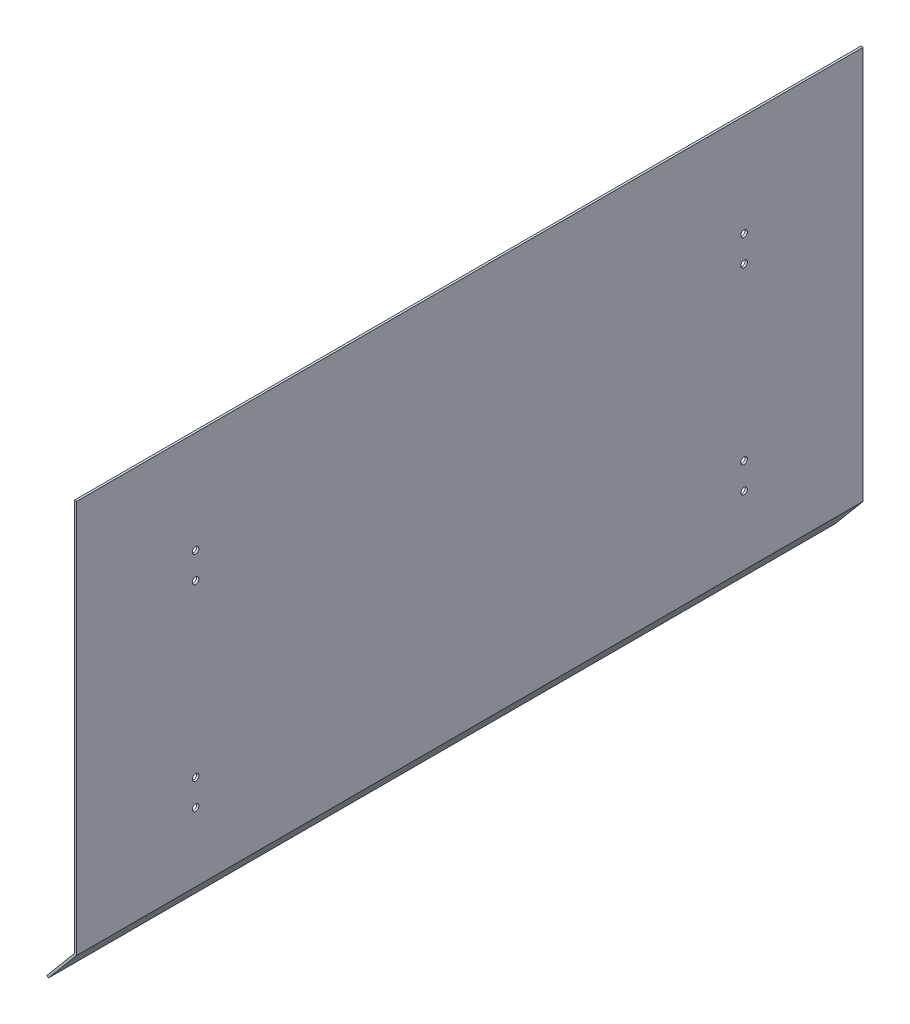
ISO-10303-21;
HEADER;
FILE_DESCRIPTION(('STEP AP214'),'2;1');
FILE_NAME('part.step','',(''),(''),'','','');
FILE_SCHEMA(('AUTOMOTIVE_DESIGN { 1 0 10303 214 1 1 1 1 }'));
ENDSEC;
DATA;
#1=APPLICATION_CONTEXT('core data for automotive mechanical design processes');
#2=APPLICATION_PROTOCOL_DEFINITION('international standard','automotive_design',2000,#1);
#3=PRODUCT_CONTEXT('',#1,'mechanical');
#4=PRODUCT('Part','Part','',(#3));
#5=PRODUCT_RELATED_PRODUCT_CATEGORY('part','',(#4));
#6=PRODUCT_DEFINITION_FORMATION('','',#4);
#7=PRODUCT_DEFINITION_CONTEXT('part definition',#1,'design');
#8=PRODUCT_DEFINITION('design','',#6,#7);
#9=PRODUCT_DEFINITION_SHAPE('','',#8);
#10=(LENGTH_UNIT() NAMED_UNIT(*) SI_UNIT(.MILLI.,.METRE.));
#11=(NAMED_UNIT(*) PLANE_ANGLE_UNIT() SI_UNIT($,.RADIAN.));
#12=(NAMED_UNIT(*) SI_UNIT($,.STERADIAN.) SOLID_ANGLE_UNIT());
#13=UNCERTAINTY_MEASURE_WITH_UNIT(LENGTH_MEASURE(1.E-05),#10,'distance_accuracy_value','');
#14=(GEOMETRIC_REPRESENTATION_CONTEXT(3) GLOBAL_UNCERTAINTY_ASSIGNED_CONTEXT((#13)) GLOBAL_UNIT_ASSIGNED_CONTEXT((#10,
#11,#12)) REPRESENTATION_CONTEXT('',''));
#15=CARTESIAN_POINT('',(0.,0.,0.));
#16=DIRECTION('',(0.,0.,1.));
#17=DIRECTION('',(1.,0.,0.));
#18=AXIS2_PLACEMENT_3D('',#15,#16,#17);
#19=CARTESIAN_POINT('',(0.,0.,360.));
#20=DIRECTION('',(-0.766044443118982,0.642787609686535,0.));
#21=DIRECTION('',(-0.642787609686535,-0.766044443118982,0.));
#22=AXIS2_PLACEMENT_3D('',#19,#20,#21);
#23=PLANE('',#22);
#24=DIRECTION('',(0.642787609686535,0.766044443118982,0.));
#25=VECTOR('',#24,1.);
#26=CARTESIAN_POINT('',(0.,0.,0.));
#27=LINE('',#26,#25);
#28=CARTESIAN_POINT('',(-12.8557521937307,-15.3208888623796,0.));
#29=VERTEX_POINT('',#28);
#30=CARTESIAN_POINT('',(0.,0.,0.));
#31=VERTEX_POINT('',#30);
#32=EDGE_CURVE('E119',#29,#31,#27,.T.);
#33=ORIENTED_EDGE('',*,*,#32,.T.);
#34=DIRECTION('',(0.,0.,-1.));
#35=VECTOR('',#34,1.);
#36=CARTESIAN_POINT('',(0.,0.,360.));
#37=LINE('',#36,#35);
#38=CARTESIAN_POINT('',(0.,0.,360.));
#39=VERTEX_POINT('',#38);
#40=EDGE_CURVE('E11',#39,#31,#37,.T.);
#41=ORIENTED_EDGE('',*,*,#40,.F.);
#42=DIRECTION('',(0.642787609686535,0.766044443118982,0.));
#43=VECTOR('',#42,1.);
#44=CARTESIAN_POINT('',(0.,0.,360.));
#45=LINE('',#44,#43);
#46=CARTESIAN_POINT('',(-12.8557521937307,-15.3208888623796,360.));
#47=VERTEX_POINT('',#46);
#48=EDGE_CURVE('E130',#47,#39,#45,.T.);
#49=ORIENTED_EDGE('',*,*,#48,.F.);
#50=DIRECTION('',(0.,0.,-1.));
#51=VECTOR('',#50,1.);
#52=CARTESIAN_POINT('',(-12.8557521937307,-15.3208888623796,360.));
#53=LINE('',#52,#51);
#54=EDGE_CURVE('E115',#47,#29,#53,.T.);
#55=ORIENTED_EDGE('',*,*,#54,.T.);
#56=EDGE_LOOP('',(#33,#41,#49,#55));
#57=FACE_BOUND('',#56,.T.);
#58=ADVANCED_FACE('F35',(#57),#23,.F.);
#59=CARTESIAN_POINT('',(0.,0.,360.));
#60=DIRECTION('',(-1.,0.,0.));
#61=DIRECTION('',(0.,0.,1.));
#62=AXIS2_PLACEMENT_3D('',#59,#60,#61);
#63=PLANE('',#62);
#64=CARTESIAN_POINT('',(0.,133.363970234266,54.5));
#65=DIRECTION('',(-1.,0.,0.));
#66=DIRECTION('',(0.,0.,1.));
#67=AXIS2_PLACEMENT_3D('',#64,#65,#66);
#68=CIRCLE('',#67,1.50000000000002);
#69=CARTESIAN_POINT('',(0.,133.363970234266,56.));
#70=VERTEX_POINT('',#69);
#71=EDGE_CURVE('E232',#70,#70,#68,.T.);
#72=ORIENTED_EDGE('',*,*,#71,.T.);
#73=EDGE_LOOP('',(#72));
#74=FACE_BOUND('',#73,.T.);
#75=CARTESIAN_POINT('',(0.,43.3639702342662,54.5));
#76=DIRECTION('',(-1.,0.,0.));
#77=DIRECTION('',(0.,0.,1.));
#78=AXIS2_PLACEMENT_3D('',#75,#76,#77);
#79=CIRCLE('',#78,1.50000000000003);
#80=CARTESIAN_POINT('',(0.,43.3639702342662,56.0000000000001));
#81=VERTEX_POINT('',#80);
#82=EDGE_CURVE('E228',#81,#81,#79,.T.);
#83=ORIENTED_EDGE('',*,*,#82,.T.);
#84=EDGE_LOOP('',(#83));
#85=FACE_BOUND('',#84,.T.);
#86=CARTESIAN_POINT('',(0.,31.3639702342662,54.5));
#87=DIRECTION('',(-1.,0.,0.));
#88=DIRECTION('',(0.,0.,1.));
#89=AXIS2_PLACEMENT_3D('',#86,#87,#88);
#90=CIRCLE('',#89,1.50000000000003);
#91=CARTESIAN_POINT('',(0.,31.3639702342662,56.0000000000001));
#92=VERTEX_POINT('',#91);
#93=EDGE_CURVE('E224',#92,#92,#90,.T.);
#94=ORIENTED_EDGE('',*,*,#93,.T.);
#95=EDGE_LOOP('',(#94));
#96=FACE_BOUND('',#95,.T.);
#97=CARTESIAN_POINT('',(0.,121.363970234266,54.5));
#98=DIRECTION('',(-1.,0.,0.));
#99=DIRECTION('',(0.,0.,1.));
#100=AXIS2_PLACEMENT_3D('',#97,#98,#99);
#101=CIRCLE('',#100,1.50000000000003);
#102=CARTESIAN_POINT('',(0.,121.363970234266,56.));
#103=VERTEX_POINT('',#102);
#104=EDGE_CURVE('E220',#103,#103,#101,.T.);
#105=ORIENTED_EDGE('',*,*,#104,.T.);
#106=EDGE_LOOP('',(#105));
#107=FACE_BOUND('',#106,.T.);
#108=CARTESIAN_POINT('',(0.,133.363970234266,305.5));
#109=DIRECTION('',(-1.,0.,0.));
#110=DIRECTION('',(0.,0.,1.));
#111=AXIS2_PLACEMENT_3D('',#108,#109,#110);
#112=CIRCLE('',#111,1.50000000000002);
#113=CARTESIAN_POINT('',(0.,133.363970234266,307.));
#114=VERTEX_POINT('',#113);
#115=EDGE_CURVE('E216',#114,#114,#112,.T.);
#116=ORIENTED_EDGE('',*,*,#115,.T.);
#117=EDGE_LOOP('',(#116));
#118=FACE_BOUND('',#117,.T.);
#119=CARTESIAN_POINT('',(0.,121.363970234266,305.5));
#120=DIRECTION('',(-1.,0.,0.));
#121=DIRECTION('',(0.,0.,1.));
#122=AXIS2_PLACEMENT_3D('',#119,#120,#121);
#123=CIRCLE('',#122,1.50000000000002);
#124=CARTESIAN_POINT('',(0.,121.363970234266,307.));
#125=VERTEX_POINT('',#124);
#126=EDGE_CURVE('E212',#125,#125,#123,.T.);
#127=ORIENTED_EDGE('',*,*,#126,.T.);
#128=EDGE_LOOP('',(#127));
#129=FACE_BOUND('',#128,.T.);
#130=CARTESIAN_POINT('',(0.,43.3639702342662,305.5));
#131=DIRECTION('',(-1.,0.,0.));
#132=DIRECTION('',(0.,0.,1.));
#133=AXIS2_PLACEMENT_3D('',#130,#131,#132);
#134=CIRCLE('',#133,1.50000000000002);
#135=CARTESIAN_POINT('',(0.,43.3639702342662,307.));
#136=VERTEX_POINT('',#135);
#137=EDGE_CURVE('E202',#136,#136,#134,.T.);
#138=ORIENTED_EDGE('',*,*,#137,.T.);
#139=EDGE_LOOP('',(#138));
#140=FACE_BOUND('',#139,.T.);
#141=CARTESIAN_POINT('',(0.,31.3639702342662,305.5));
#142=DIRECTION('',(-1.,0.,0.));
#143=DIRECTION('',(0.,0.,1.));
#144=AXIS2_PLACEMENT_3D('',#141,#142,#143);
#145=CIRCLE('',#144,1.50000000000002);
#146=CARTESIAN_POINT('',(0.,31.3639702342662,307.));
#147=VERTEX_POINT('',#146);
#148=EDGE_CURVE('E123',#147,#147,#145,.T.);
#149=ORIENTED_EDGE('',*,*,#148,.T.);
#150=EDGE_LOOP('',(#149));
#151=FACE_BOUND('',#150,.T.);
#152=DIRECTION('',(0.,1.,0.));
#153=VECTOR('',#152,1.);
#154=CARTESIAN_POINT('',(0.,0.,0.));
#155=LINE('',#154,#153);
#156=CARTESIAN_POINT('',(0.,180.,0.));
#157=VERTEX_POINT('',#156);
#158=EDGE_CURVE('E122',#31,#157,#155,.T.);
#159=ORIENTED_EDGE('',*,*,#158,.T.);
#160=DIRECTION('',(0.,0.,-1.));
#161=VECTOR('',#160,1.);
#162=CARTESIAN_POINT('',(0.,180.,360.));
#163=LINE('',#162,#161);
#164=CARTESIAN_POINT('',(0.,180.,360.));
#165=VERTEX_POINT('',#164);
#166=EDGE_CURVE('E43',#165,#157,#163,.T.);
#167=ORIENTED_EDGE('',*,*,#166,.F.);
#168=DIRECTION('',(0.,1.,0.));
#169=VECTOR('',#168,1.);
#170=CARTESIAN_POINT('',(0.,0.,360.));
#171=LINE('',#170,#169);
#172=EDGE_CURVE('E88',#39,#165,#171,.T.);
#173=ORIENTED_EDGE('',*,*,#172,.F.);
#174=ORIENTED_EDGE('',*,*,#40,.T.);
#175=EDGE_LOOP('',(#159,#167,#173,#174));
#176=FACE_BOUND('',#175,.T.);
#177=ADVANCED_FACE('F154',(#74,#85,#96,#107,#118,#129,#140,#151,#176),#63,.F.);
#178=CARTESIAN_POINT('',(-1.,180.,360.));
#179=DIRECTION('',(0.,-1.,0.));
#180=DIRECTION('',(0.,0.,-1.));
#181=AXIS2_PLACEMENT_3D('',#178,#179,#180);
#182=PLANE('',#181);
#183=DIRECTION('',(-1.,0.,0.));
#184=VECTOR('',#183,1.);
#185=CARTESIAN_POINT('',(-1.,180.,0.));
#186=LINE('',#185,#184);
#187=CARTESIAN_POINT('',(-1.,180.,0.));
#188=VERTEX_POINT('',#187);
#189=EDGE_CURVE('E125',#157,#188,#186,.T.);
#190=ORIENTED_EDGE('',*,*,#189,.T.);
#191=DIRECTION('',(0.,0.,-1.));
#192=VECTOR('',#191,1.);
#193=CARTESIAN_POINT('',(-1.,180.,360.));
#194=LINE('',#193,#192);
#195=CARTESIAN_POINT('',(-1.,180.,360.));
#196=VERTEX_POINT('',#195);
#197=EDGE_CURVE('E110',#196,#188,#194,.T.);
#198=ORIENTED_EDGE('',*,*,#197,.F.);
#199=DIRECTION('',(-1.,0.,0.));
#200=VECTOR('',#199,1.);
#201=CARTESIAN_POINT('',(-1.,180.,360.));
#202=LINE('',#201,#200);
#203=EDGE_CURVE('E101',#165,#196,#202,.T.);
#204=ORIENTED_EDGE('',*,*,#203,.F.);
#205=ORIENTED_EDGE('',*,*,#166,.T.);
#206=EDGE_LOOP('',(#190,#198,#204,#205));
#207=FACE_BOUND('',#206,.T.);
#208=ADVANCED_FACE('F136',(#207),#182,.F.);
#209=CARTESIAN_POINT('',(-1.,0.363970234266199,360.));
#210=DIRECTION('',(1.,0.,0.));
#211=DIRECTION('',(0.,0.,-1.));
#212=AXIS2_PLACEMENT_3D('',#209,#210,#211);
#213=PLANE('',#212);
#214=CARTESIAN_POINT('',(-1.,133.363970234266,54.5));
#215=DIRECTION('',(-1.,0.,0.));
#216=DIRECTION('',(0.,0.,-1.));
#217=AXIS2_PLACEMENT_3D('',#214,#215,#216);
#218=CIRCLE('',#217,1.50000000000002);
#219=CARTESIAN_POINT('',(-1.,133.363970234266,53.));
#220=VERTEX_POINT('',#219);
#221=EDGE_CURVE('E173',#220,#220,#218,.T.);
#222=ORIENTED_EDGE('',*,*,#221,.F.);
#223=EDGE_LOOP('',(#222));
#224=FACE_BOUND('',#223,.T.);
#225=CARTESIAN_POINT('',(-1.,43.3639702342662,54.5));
#226=DIRECTION('',(-1.,0.,0.));
#227=DIRECTION('',(0.,0.,-1.));
#228=AXIS2_PLACEMENT_3D('',#225,#226,#227);
#229=CIRCLE('',#228,1.50000000000003);
#230=CARTESIAN_POINT('',(-1.,43.3639702342662,53.));
#231=VERTEX_POINT('',#230);
#232=EDGE_CURVE('E177',#231,#231,#229,.T.);
#233=ORIENTED_EDGE('',*,*,#232,.F.);
#234=EDGE_LOOP('',(#233));
#235=FACE_BOUND('',#234,.T.);
#236=CARTESIAN_POINT('',(-1.,31.3639702342662,54.5));
#237=DIRECTION('',(-1.,0.,0.));
#238=DIRECTION('',(0.,0.,-1.));
#239=AXIS2_PLACEMENT_3D('',#236,#237,#238);
#240=CIRCLE('',#239,1.50000000000003);
#241=CARTESIAN_POINT('',(-1.,31.3639702342662,53.));
#242=VERTEX_POINT('',#241);
#243=EDGE_CURVE('E181',#242,#242,#240,.T.);
#244=ORIENTED_EDGE('',*,*,#243,.F.);
#245=EDGE_LOOP('',(#244));
#246=FACE_BOUND('',#245,.T.);
#247=CARTESIAN_POINT('',(-1.,121.363970234266,54.5));
#248=DIRECTION('',(-1.,0.,0.));
#249=DIRECTION('',(0.,0.,-1.));
#250=AXIS2_PLACEMENT_3D('',#247,#248,#249);
#251=CIRCLE('',#250,1.50000000000003);
#252=CARTESIAN_POINT('',(-1.,121.363970234266,53.));
#253=VERTEX_POINT('',#252);
#254=EDGE_CURVE('E185',#253,#253,#251,.T.);
#255=ORIENTED_EDGE('',*,*,#254,.F.);
#256=EDGE_LOOP('',(#255));
#257=FACE_BOUND('',#256,.T.);
#258=CARTESIAN_POINT('',(-1.,133.363970234266,305.5));
#259=DIRECTION('',(-1.,0.,0.));
#260=DIRECTION('',(0.,0.,1.));
#261=AXIS2_PLACEMENT_3D('',#258,#259,#260);
#262=CIRCLE('',#261,1.50000000000002);
#263=CARTESIAN_POINT('',(-1.,133.363970234266,307.));
#264=VERTEX_POINT('',#263);
#265=EDGE_CURVE('E189',#264,#264,#262,.T.);
#266=ORIENTED_EDGE('',*,*,#265,.F.);
#267=EDGE_LOOP('',(#266));
#268=FACE_BOUND('',#267,.T.);
#269=CARTESIAN_POINT('',(-1.,121.363970234266,305.5));
#270=DIRECTION('',(-1.,0.,0.));
#271=DIRECTION('',(0.,0.,1.));
#272=AXIS2_PLACEMENT_3D('',#269,#270,#271);
#273=CIRCLE('',#272,1.50000000000002);
#274=CARTESIAN_POINT('',(-1.,121.363970234266,307.));
#275=VERTEX_POINT('',#274);
#276=EDGE_CURVE('E193',#275,#275,#273,.T.);
#277=ORIENTED_EDGE('',*,*,#276,.F.);
#278=EDGE_LOOP('',(#277));
#279=FACE_BOUND('',#278,.T.);
#280=CARTESIAN_POINT('',(-1.,43.3639702342662,305.5));
#281=DIRECTION('',(-1.,0.,0.));
#282=DIRECTION('',(0.,0.,1.));
#283=AXIS2_PLACEMENT_3D('',#280,#281,#282);
#284=CIRCLE('',#283,1.50000000000002);
#285=CARTESIAN_POINT('',(-1.,43.3639702342662,307.));
#286=VERTEX_POINT('',#285);
#287=EDGE_CURVE('E197',#286,#286,#284,.T.);
#288=ORIENTED_EDGE('',*,*,#287,.F.);
#289=EDGE_LOOP('',(#288));
#290=FACE_BOUND('',#289,.T.);
#291=CARTESIAN_POINT('',(-1.,31.3639702342662,305.5));
#292=DIRECTION('',(-1.,0.,0.));
#293=DIRECTION('',(0.,0.,1.));
#294=AXIS2_PLACEMENT_3D('',#291,#292,#293);
#295=CIRCLE('',#294,1.50000000000002);
#296=CARTESIAN_POINT('',(-1.,31.3639702342662,307.));
#297=VERTEX_POINT('',#296);
#298=EDGE_CURVE('E200',#297,#297,#295,.T.);
#299=ORIENTED_EDGE('',*,*,#298,.F.);
#300=EDGE_LOOP('',(#299));
#301=FACE_BOUND('',#300,.T.);
#302=DIRECTION('',(0.,-1.,0.));
#303=VECTOR('',#302,1.);
#304=CARTESIAN_POINT('',(-1.,0.363970234266199,0.));
#305=LINE('',#304,#303);
#306=CARTESIAN_POINT('',(-1.,0.363970234266199,0.));
#307=VERTEX_POINT('',#306);
#308=EDGE_CURVE('E109',#188,#307,#305,.T.);
#309=ORIENTED_EDGE('',*,*,#308,.T.);
#310=DIRECTION('',(0.,0.,-1.));
#311=VECTOR('',#310,1.);
#312=CARTESIAN_POINT('',(-1.,0.363970234266199,360.));
#313=LINE('',#312,#311);
#314=CARTESIAN_POINT('',(-1.,0.363970234266199,360.));
#315=VERTEX_POINT('',#314);
#316=EDGE_CURVE('E106',#315,#307,#313,.T.);
#317=ORIENTED_EDGE('',*,*,#316,.F.);
#318=DIRECTION('',(0.,-1.,0.));
#319=VECTOR('',#318,1.);
#320=CARTESIAN_POINT('',(-1.,0.363970234266199,360.));
#321=LINE('',#320,#319);
#322=EDGE_CURVE('E95',#196,#315,#321,.T.);
#323=ORIENTED_EDGE('',*,*,#322,.F.);
#324=ORIENTED_EDGE('',*,*,#197,.T.);
#325=EDGE_LOOP('',(#309,#317,#323,#324));
#326=FACE_BOUND('',#325,.T.);
#327=ADVANCED_FACE('F107',(#224,#235,#246,#257,#268,#279,#290,#301,#326),#213,.F.);
#328=CARTESIAN_POINT('',(-1.,0.363970234266199,360.));
#329=DIRECTION('',(0.766044443118982,-0.642787609686535,0.));
#330=DIRECTION('',(0.642787609686535,0.766044443118982,0.));
#331=AXIS2_PLACEMENT_3D('',#328,#329,#330);
#332=PLANE('',#331);
#333=DIRECTION('',(-0.642787609686535,-0.766044443118982,0.));
#334=VECTOR('',#333,1.);
#335=CARTESIAN_POINT('',(-1.,0.363970234266199,0.));
#336=LINE('',#335,#334);
#337=CARTESIAN_POINT('',(-13.6217966368497,-14.6781012526931,0.));
#338=VERTEX_POINT('',#337);
#339=EDGE_CURVE('E74',#307,#338,#336,.T.);
#340=ORIENTED_EDGE('',*,*,#339,.T.);
#341=DIRECTION('',(0.,0.,-1.));
#342=VECTOR('',#341,1.);
#343=CARTESIAN_POINT('',(-13.6217966368497,-14.6781012526931,360.));
#344=LINE('',#343,#342);
#345=CARTESIAN_POINT('',(-13.6217966368497,-14.6781012526931,360.));
#346=VERTEX_POINT('',#345);
#347=EDGE_CURVE('E111',#346,#338,#344,.T.);
#348=ORIENTED_EDGE('',*,*,#347,.F.);
#349=DIRECTION('',(-0.642787609686535,-0.766044443118982,0.));
#350=VECTOR('',#349,1.);
#351=CARTESIAN_POINT('',(-1.,0.363970234266199,360.));
#352=LINE('',#351,#350);
#353=EDGE_CURVE('E99',#315,#346,#352,.T.);
#354=ORIENTED_EDGE('',*,*,#353,.F.);
#355=ORIENTED_EDGE('',*,*,#316,.T.);
#356=EDGE_LOOP('',(#340,#348,#354,#355));
#357=FACE_BOUND('',#356,.T.);
#358=ADVANCED_FACE('F113',(#357),#332,.F.);
#359=CARTESIAN_POINT('',(-13.6217966368497,-14.6781012526931,360.));
#360=DIRECTION('',(0.642787609686534,0.766044443118982,0.));
#361=DIRECTION('',(-0.766044443118983,0.642787609686534,0.));
#362=AXIS2_PLACEMENT_3D('',#359,#360,#361);
#363=PLANE('',#362);
#364=DIRECTION('',(0.766044443118982,-0.642787609686534,0.));
#365=VECTOR('',#364,1.);
#366=CARTESIAN_POINT('',(-13.6217966368497,-14.6781012526931,0.));
#367=LINE('',#366,#365);
#368=EDGE_CURVE('E80',#338,#29,#367,.T.);
#369=ORIENTED_EDGE('',*,*,#368,.T.);
#370=ORIENTED_EDGE('',*,*,#54,.F.);
#371=DIRECTION('',(0.766044443118982,-0.642787609686534,0.));
#372=VECTOR('',#371,1.);
#373=CARTESIAN_POINT('',(-13.6217966368497,-14.6781012526931,360.));
#374=LINE('',#373,#372);
#375=EDGE_CURVE('E51',#346,#47,#374,.T.);
#376=ORIENTED_EDGE('',*,*,#375,.F.);
#377=ORIENTED_EDGE('',*,*,#347,.T.);
#378=EDGE_LOOP('',(#369,#370,#376,#377));
#379=FACE_BOUND('',#378,.T.);
#380=ADVANCED_FACE('F143',(#379),#363,.F.);
#381=CARTESIAN_POINT('',(0.,0.,360.));
#382=DIRECTION('',(0.,0.,1.));
#383=DIRECTION('',(1.,0.,0.));
#384=AXIS2_PLACEMENT_3D('',#381,#382,#383);
#385=PLANE('',#384);
#386=ORIENTED_EDGE('',*,*,#48,.T.);
#387=ORIENTED_EDGE('',*,*,#172,.T.);
#388=ORIENTED_EDGE('',*,*,#203,.T.);
#389=ORIENTED_EDGE('',*,*,#322,.T.);
#390=ORIENTED_EDGE('',*,*,#353,.T.);
#391=ORIENTED_EDGE('',*,*,#375,.T.);
#392=EDGE_LOOP('',(#386,#387,#388,#389,#390,#391));
#393=FACE_BOUND('',#392,.T.);
#394=ADVANCED_FACE('F97',(#393),#385,.T.);
#395=CARTESIAN_POINT('',(0.,0.,0.));
#396=DIRECTION('',(0.,0.,1.));
#397=DIRECTION('',(1.,0.,0.));
#398=AXIS2_PLACEMENT_3D('',#395,#396,#397);
#399=PLANE('',#398);
#400=ORIENTED_EDGE('',*,*,#32,.F.);
#401=ORIENTED_EDGE('',*,*,#368,.F.);
#402=ORIENTED_EDGE('',*,*,#339,.F.);
#403=ORIENTED_EDGE('',*,*,#308,.F.);
#404=ORIENTED_EDGE('',*,*,#189,.F.);
#405=ORIENTED_EDGE('',*,*,#158,.F.);
#406=EDGE_LOOP('',(#400,#401,#402,#403,#404,#405));
#407=FACE_BOUND('',#406,.T.);
#408=ADVANCED_FACE('F139',(#407),#399,.F.);
#409=CARTESIAN_POINT('',(379.,31.3639702342662,305.5));
#410=DIRECTION('',(-1.,0.,0.));
#411=DIRECTION('',(0.,0.,1.));
#412=AXIS2_PLACEMENT_3D('',#409,#410,#411);
#413=CYLINDRICAL_SURFACE('',#412,1.50000000000002);
#414=ORIENTED_EDGE('',*,*,#298,.T.);
#415=EDGE_LOOP('',(#414));
#416=FACE_BOUND('',#415,.T.);
#417=ORIENTED_EDGE('',*,*,#148,.F.);
#418=EDGE_LOOP('',(#417));
#419=FACE_BOUND('',#418,.T.);
#420=ADVANCED_FACE('F266',(#416,#419),#413,.F.);
#421=CARTESIAN_POINT('',(379.,43.3639702342662,305.5));
#422=DIRECTION('',(-1.,0.,0.));
#423=DIRECTION('',(0.,0.,1.));
#424=AXIS2_PLACEMENT_3D('',#421,#422,#423);
#425=CYLINDRICAL_SURFACE('',#424,1.50000000000002);
#426=ORIENTED_EDGE('',*,*,#287,.T.);
#427=EDGE_LOOP('',(#426));
#428=FACE_BOUND('',#427,.T.);
#429=ORIENTED_EDGE('',*,*,#137,.F.);
#430=EDGE_LOOP('',(#429));
#431=FACE_BOUND('',#430,.T.);
#432=ADVANCED_FACE('F262',(#428,#431),#425,.F.);
#433=CARTESIAN_POINT('',(379.,121.363970234266,305.5));
#434=DIRECTION('',(-1.,0.,0.));
#435=DIRECTION('',(0.,0.,1.));
#436=AXIS2_PLACEMENT_3D('',#433,#434,#435);
#437=CYLINDRICAL_SURFACE('',#436,1.50000000000002);
#438=ORIENTED_EDGE('',*,*,#276,.T.);
#439=EDGE_LOOP('',(#438));
#440=FACE_BOUND('',#439,.T.);
#441=ORIENTED_EDGE('',*,*,#126,.F.);
#442=EDGE_LOOP('',(#441));
#443=FACE_BOUND('',#442,.T.);
#444=ADVANCED_FACE('F258',(#440,#443),#437,.F.);
#445=CARTESIAN_POINT('',(379.,133.363970234266,305.5));
#446=DIRECTION('',(-1.,0.,0.));
#447=DIRECTION('',(0.,0.,1.));
#448=AXIS2_PLACEMENT_3D('',#445,#446,#447);
#449=CYLINDRICAL_SURFACE('',#448,1.50000000000002);
#450=ORIENTED_EDGE('',*,*,#265,.T.);
#451=EDGE_LOOP('',(#450));
#452=FACE_BOUND('',#451,.T.);
#453=ORIENTED_EDGE('',*,*,#115,.F.);
#454=EDGE_LOOP('',(#453));
#455=FACE_BOUND('',#454,.T.);
#456=ADVANCED_FACE('F254',(#452,#455),#449,.F.);
#457=CARTESIAN_POINT('',(379.,121.363970234266,54.5));
#458=DIRECTION('',(-1.,0.,0.));
#459=DIRECTION('',(0.,0.,1.));
#460=AXIS2_PLACEMENT_3D('',#457,#458,#459);
#461=CYLINDRICAL_SURFACE('',#460,1.50000000000003);
#462=ORIENTED_EDGE('',*,*,#254,.T.);
#463=EDGE_LOOP('',(#462));
#464=FACE_BOUND('',#463,.T.);
#465=ORIENTED_EDGE('',*,*,#104,.F.);
#466=EDGE_LOOP('',(#465));
#467=FACE_BOUND('',#466,.T.);
#468=ADVANCED_FACE('F250',(#464,#467),#461,.F.);
#469=CARTESIAN_POINT('',(379.,31.3639702342662,54.5));
#470=DIRECTION('',(-1.,0.,0.));
#471=DIRECTION('',(0.,0.,1.));
#472=AXIS2_PLACEMENT_3D('',#469,#470,#471);
#473=CYLINDRICAL_SURFACE('',#472,1.50000000000003);
#474=ORIENTED_EDGE('',*,*,#243,.T.);
#475=EDGE_LOOP('',(#474));
#476=FACE_BOUND('',#475,.T.);
#477=ORIENTED_EDGE('',*,*,#93,.F.);
#478=EDGE_LOOP('',(#477));
#479=FACE_BOUND('',#478,.T.);
#480=ADVANCED_FACE('F244',(#476,#479),#473,.F.);
#481=CARTESIAN_POINT('',(379.,43.3639702342662,54.5));
#482=DIRECTION('',(-1.,0.,0.));
#483=DIRECTION('',(0.,0.,1.));
#484=AXIS2_PLACEMENT_3D('',#481,#482,#483);
#485=CYLINDRICAL_SURFACE('',#484,1.50000000000003);
#486=ORIENTED_EDGE('',*,*,#232,.T.);
#487=EDGE_LOOP('',(#486));
#488=FACE_BOUND('',#487,.T.);
#489=ORIENTED_EDGE('',*,*,#82,.F.);
#490=EDGE_LOOP('',(#489));
#491=FACE_BOUND('',#490,.T.);
#492=ADVANCED_FACE('F238',(#488,#491),#485,.F.);
#493=CARTESIAN_POINT('',(379.,133.363970234266,54.5));
#494=DIRECTION('',(-1.,0.,0.));
#495=DIRECTION('',(0.,0.,1.));
#496=AXIS2_PLACEMENT_3D('',#493,#494,#495);
#497=CYLINDRICAL_SURFACE('',#496,1.50000000000002);
#498=ORIENTED_EDGE('',*,*,#221,.T.);
#499=EDGE_LOOP('',(#498));
#500=FACE_BOUND('',#499,.T.);
#501=ORIENTED_EDGE('',*,*,#71,.F.);
#502=EDGE_LOOP('',(#501));
#503=FACE_BOUND('',#502,.T.);
#504=ADVANCED_FACE('F235',(#500,#503),#497,.F.);
#505=CLOSED_SHELL('',(#58,#177,#208,#327,#358,#380,#394,#408,#420,#432,#444,#456,#468,#480,#492,#504));
#506=MANIFOLD_SOLID_BREP('B2',#505);
#507=ADVANCED_BREP_SHAPE_REPRESENTATION('',(#18,#506),#14);
#508=SHAPE_DEFINITION_REPRESENTATION(#9,#507);
ENDSEC;
END-ISO-10303-21;
